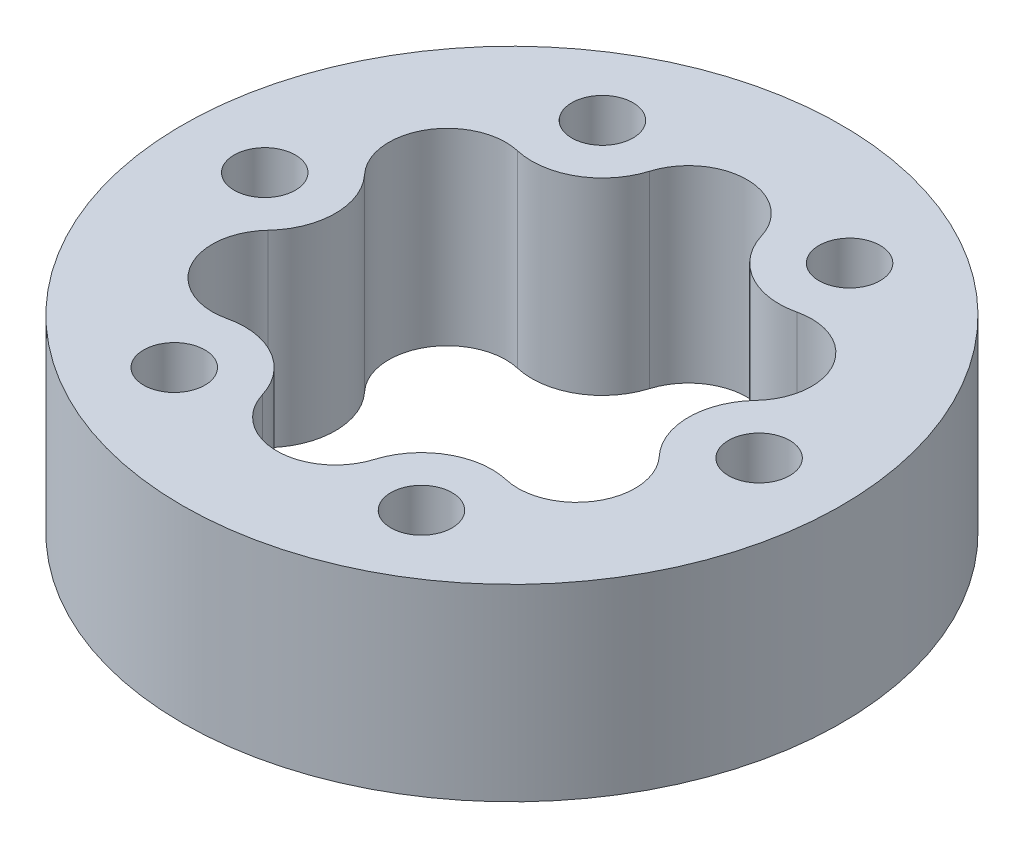
ISO-10303-21;
HEADER;
FILE_DESCRIPTION(('STEP AP214'),'2;1');
FILE_NAME('part.step','',(''),(''),'','','');
FILE_SCHEMA(('AUTOMOTIVE_DESIGN { 1 0 10303 214 1 1 1 1 }'));
ENDSEC;
DATA;
#1=APPLICATION_CONTEXT('core data for automotive mechanical design processes');
#2=APPLICATION_PROTOCOL_DEFINITION('international standard','automotive_design',2000,#1);
#3=PRODUCT_CONTEXT('',#1,'mechanical');
#4=PRODUCT('Part','Part','',(#3));
#5=PRODUCT_RELATED_PRODUCT_CATEGORY('part','',(#4));
#6=PRODUCT_DEFINITION_FORMATION('','',#4);
#7=PRODUCT_DEFINITION_CONTEXT('part definition',#1,'design');
#8=PRODUCT_DEFINITION('design','',#6,#7);
#9=PRODUCT_DEFINITION_SHAPE('','',#8);
#10=(LENGTH_UNIT() NAMED_UNIT(*) SI_UNIT(.MILLI.,.METRE.));
#11=(NAMED_UNIT(*) PLANE_ANGLE_UNIT() SI_UNIT($,.RADIAN.));
#12=(NAMED_UNIT(*) SI_UNIT($,.STERADIAN.) SOLID_ANGLE_UNIT());
#13=UNCERTAINTY_MEASURE_WITH_UNIT(LENGTH_MEASURE(1.E-05),#10,'distance_accuracy_value','');
#14=(GEOMETRIC_REPRESENTATION_CONTEXT(3) GLOBAL_UNCERTAINTY_ASSIGNED_CONTEXT((#13)) GLOBAL_UNIT_ASSIGNED_CONTEXT((#10,
#11,#12)) REPRESENTATION_CONTEXT('',''));
#15=CARTESIAN_POINT('',(0.,0.,0.));
#16=DIRECTION('',(0.,0.,1.));
#17=DIRECTION('',(1.,0.,0.));
#18=AXIS2_PLACEMENT_3D('',#15,#16,#17);
#19=CARTESIAN_POINT('',(0.,16.,0.));
#20=DIRECTION('',(0.,1.,0.));
#21=DIRECTION('',(0.,0.,1.));
#22=AXIS2_PLACEMENT_3D('',#19,#20,#21);
#23=PLANE('',#22);
#24=CARTESIAN_POINT('',(-10.5000000000001,16.,-18.1865334794733));
#25=DIRECTION('',(0.,1.,0.));
#26=DIRECTION('',(0.,0.,1.));
#27=AXIS2_PLACEMENT_3D('',#24,#25,#26);
#28=CIRCLE('',#27,2.6);
#29=CARTESIAN_POINT('',(-10.5000000000001,16.,-15.5865334794733));
#30=VERTEX_POINT('',#29);
#31=EDGE_CURVE('E230',#30,#30,#28,.T.);
#32=ORIENTED_EDGE('',*,*,#31,.F.);
#33=EDGE_LOOP('',(#32));
#34=FACE_BOUND('',#33,.T.);
#35=CARTESIAN_POINT('',(-10.5000000000001,16.,18.1865334794731));
#36=DIRECTION('',(0.,1.,0.));
#37=DIRECTION('',(0.,0.,1.));
#38=AXIS2_PLACEMENT_3D('',#35,#36,#37);
#39=CIRCLE('',#38,2.6);
#40=CARTESIAN_POINT('',(-10.5000000000001,16.,20.7865334794731));
#41=VERTEX_POINT('',#40);
#42=EDGE_CURVE('E242',#41,#41,#39,.T.);
#43=ORIENTED_EDGE('',*,*,#42,.F.);
#44=EDGE_LOOP('',(#43));
#45=FACE_BOUND('',#44,.T.);
#46=CARTESIAN_POINT('',(20.9999999999999,16.,0.));
#47=DIRECTION('',(0.,1.,0.));
#48=DIRECTION('',(0.,0.,1.));
#49=AXIS2_PLACEMENT_3D('',#46,#47,#48);
#50=CIRCLE('',#49,2.6);
#51=CARTESIAN_POINT('',(20.9999999999999,16.,2.59999999999992));
#52=VERTEX_POINT('',#51);
#53=EDGE_CURVE('E254',#52,#52,#50,.T.);
#54=ORIENTED_EDGE('',*,*,#53,.F.);
#55=EDGE_LOOP('',(#54));
#56=FACE_BOUND('',#55,.T.);
#57=CARTESIAN_POINT('',(0.,16.,0.));
#58=DIRECTION('',(0.,1.,0.));
#59=DIRECTION('',(0.,0.,1.));
#60=AXIS2_PLACEMENT_3D('',#57,#58,#59);
#61=CIRCLE('',#60,28.);
#62=CARTESIAN_POINT('',(0.,16.,28.));
#63=VERTEX_POINT('',#62);
#64=EDGE_CURVE('E11',#63,#63,#61,.T.);
#65=ORIENTED_EDGE('',*,*,#64,.T.);
#66=EDGE_LOOP('',(#65));
#67=FACE_BOUND('',#66,.T.);
#68=CARTESIAN_POINT('',(10.4999999999999,16.,-18.1865334794733));
#69=DIRECTION('',(0.,1.,0.));
#70=DIRECTION('',(0.,0.,1.));
#71=AXIS2_PLACEMENT_3D('',#68,#69,#70);
#72=CIRCLE('',#71,2.6);
#73=CARTESIAN_POINT('',(10.4999999999999,16.,-15.5865334794733));
#74=VERTEX_POINT('',#73);
#75=EDGE_CURVE('E260',#74,#74,#72,.T.);
#76=ORIENTED_EDGE('',*,*,#75,.F.);
#77=EDGE_LOOP('',(#76));
#78=FACE_BOUND('',#77,.T.);
#79=CARTESIAN_POINT('',(10.4999999999999,16.,18.1865334794731));
#80=DIRECTION('',(0.,1.,0.));
#81=DIRECTION('',(0.,0.,1.));
#82=AXIS2_PLACEMENT_3D('',#79,#80,#81);
#83=CIRCLE('',#82,2.6);
#84=CARTESIAN_POINT('',(10.4999999999999,16.,20.7865334794731));
#85=VERTEX_POINT('',#84);
#86=EDGE_CURVE('E248',#85,#85,#83,.T.);
#87=ORIENTED_EDGE('',*,*,#86,.F.);
#88=EDGE_LOOP('',(#87));
#89=FACE_BOUND('',#88,.T.);
#90=CARTESIAN_POINT('',(-21.,16.,1.2805208282618E-13));
#91=DIRECTION('',(0.,1.,0.));
#92=DIRECTION('',(0.,0.,1.));
#93=AXIS2_PLACEMENT_3D('',#90,#91,#92);
#94=CIRCLE('',#93,2.6);
#95=CARTESIAN_POINT('',(-21.,16.,2.60000000000013));
#96=VERTEX_POINT('',#95);
#97=EDGE_CURVE('E236',#96,#96,#94,.T.);
#98=ORIENTED_EDGE('',*,*,#97,.F.);
#99=EDGE_LOOP('',(#98));
#100=FACE_BOUND('',#99,.T.);
#101=CARTESIAN_POINT('',(0.,16.,-15.));
#102=DIRECTION('',(0.,1.,0.));
#103=DIRECTION('',(0.,0.,1.));
#104=AXIS2_PLACEMENT_3D('',#101,#102,#103);
#105=CIRCLE('',#104,4.97287544884227);
#106=CARTESIAN_POINT('',(4.75856966173348,16.,-16.444127765859));
#107=VERTEX_POINT('',#106);
#108=CARTESIAN_POINT('',(-4.75856923533456,16.,-16.4441291708941));
#109=VERTEX_POINT('',#108);
#110=EDGE_CURVE('E136',#107,#109,#105,.T.);
#111=ORIENTED_EDGE('',*,*,#110,.F.);
#112=CARTESIAN_POINT('',(10.4999999999999,16.,-18.1865334794733));
#113=DIRECTION('',(0.,1.,0.));
#114=DIRECTION('',(0.,0.,1.));
#115=AXIS2_PLACEMENT_3D('',#112,#113,#114);
#116=CIRCLE('',#115,6.00000000000013);
#117=CARTESIAN_POINT('',(11.8617489874396,16.,-12.343106428914));
#118=VERTEX_POINT('',#117);
#119=EDGE_CURVE('E226',#118,#107,#116,.F.);
#120=ORIENTED_EDGE('',*,*,#119,.F.);
#121=CARTESIAN_POINT('',(12.9903810567666,16.,-7.49999999999997));
#122=DIRECTION('',(0.,1.,0.));
#123=DIRECTION('',(0.,0.,1.));
#124=AXIS2_PLACEMENT_3D('',#121,#122,#123);
#125=CIRCLE('',#124,4.97287544884224);
#126=CARTESIAN_POINT('',(16.6203172191778,16.,-4.10102167019009));
#127=VERTEX_POINT('',#126);
#128=EDGE_CURVE('E224',#127,#118,#125,.T.);
#129=ORIENTED_EDGE('',*,*,#128,.F.);
#130=CARTESIAN_POINT('',(21.,16.,0.));
#131=DIRECTION('',(0.,1.,0.));
#132=DIRECTION('',(0.,0.,1.));
#133=AXIS2_PLACEMENT_3D('',#130,#131,#132);
#134=CIRCLE('',#133,6.00000000000022);
#135=CARTESIAN_POINT('',(16.6203182227742,16.,4.10102274198015));
#136=VERTEX_POINT('',#135);
#137=EDGE_CURVE('E222',#136,#127,#134,.F.);
#138=ORIENTED_EDGE('',*,*,#137,.F.);
#139=CARTESIAN_POINT('',(12.9903810567665,16.,7.50000000000006));
#140=DIRECTION('',(0.,1.,0.));
#141=DIRECTION('',(0.,0.,1.));
#142=AXIS2_PLACEMENT_3D('',#139,#140,#141);
#143=CIRCLE('',#142,4.97287544884221);
#144=CARTESIAN_POINT('',(11.8617475574439,16.,12.3431060956689));
#145=VERTEX_POINT('',#144);
#146=EDGE_CURVE('E220',#145,#136,#143,.T.);
#147=ORIENTED_EDGE('',*,*,#146,.F.);
#148=CARTESIAN_POINT('',(10.5,16.,18.1865334794732));
#149=DIRECTION('',(0.,1.,0.));
#150=DIRECTION('',(0.,0.,1.));
#151=AXIS2_PLACEMENT_3D('',#148,#149,#150);
#152=CIRCLE('',#151,6.00000000000022);
#153=CARTESIAN_POINT('',(4.75856923533452,16.,16.4441291708941));
#154=VERTEX_POINT('',#153);
#155=EDGE_CURVE('E218',#154,#145,#152,.F.);
#156=ORIENTED_EDGE('',*,*,#155,.F.);
#157=CARTESIAN_POINT('',(-1.04517089427603E-13,16.,15.));
#158=DIRECTION('',(0.,1.,0.));
#159=DIRECTION('',(0.,0.,1.));
#160=AXIS2_PLACEMENT_3D('',#157,#158,#159);
#161=CIRCLE('',#160,4.97287544884223);
#162=CARTESIAN_POINT('',(-4.75856966173388,16.,16.4441277658589));
#163=VERTEX_POINT('',#162);
#164=EDGE_CURVE('E216',#163,#154,#161,.T.);
#165=ORIENTED_EDGE('',*,*,#164,.F.);
#166=CARTESIAN_POINT('',(-10.5,16.,18.1865334794732));
#167=DIRECTION('',(0.,1.,0.));
#168=DIRECTION('',(0.,0.,1.));
#169=AXIS2_PLACEMENT_3D('',#166,#167,#168);
#170=CIRCLE('',#169,6.00000000000014);
#171=CARTESIAN_POINT('',(-11.8617489874398,16.,12.3431064289139));
#172=VERTEX_POINT('',#171);
#173=EDGE_CURVE('E214',#172,#163,#170,.F.);
#174=ORIENTED_EDGE('',*,*,#173,.F.);
#175=CARTESIAN_POINT('',(-12.9903810567667,16.,7.49999999999988));
#176=DIRECTION('',(0.,1.,0.));
#177=DIRECTION('',(0.,0.,1.));
#178=AXIS2_PLACEMENT_3D('',#175,#176,#177);
#179=CIRCLE('',#178,4.97287544884227);
#180=CARTESIAN_POINT('',(-16.620317219178,16.,4.10102167019005));
#181=VERTEX_POINT('',#180);
#182=EDGE_CURVE('E212',#181,#172,#179,.T.);
#183=ORIENTED_EDGE('',*,*,#182,.F.);
#184=CARTESIAN_POINT('',(-21.,16.,0.));
#185=DIRECTION('',(0.,1.,0.));
#186=DIRECTION('',(0.,0.,1.));
#187=AXIS2_PLACEMENT_3D('',#184,#185,#186);
#188=CIRCLE('',#187,6.00000000000005);
#189=CARTESIAN_POINT('',(-16.6203182227744,16.,-4.10102274198029));
#190=VERTEX_POINT('',#189);
#191=EDGE_CURVE('E210',#190,#181,#188,.F.);
#192=ORIENTED_EDGE('',*,*,#191,.F.);
#193=CARTESIAN_POINT('',(-12.9903810567665,16.,-7.50000000000015));
#194=DIRECTION('',(0.,1.,0.));
#195=DIRECTION('',(0.,0.,1.));
#196=AXIS2_PLACEMENT_3D('',#193,#194,#195);
#197=CIRCLE('',#196,4.97287544884229);
#198=CARTESIAN_POINT('',(-11.8617475574441,16.,-12.3431060956691));
#199=VERTEX_POINT('',#198);
#200=EDGE_CURVE('E208',#199,#190,#197,.T.);
#201=ORIENTED_EDGE('',*,*,#200,.F.);
#202=CARTESIAN_POINT('',(-10.4999999999999,16.,-18.1865334794733));
#203=DIRECTION('',(0.,1.,0.));
#204=DIRECTION('',(0.,0.,1.));
#205=AXIS2_PLACEMENT_3D('',#202,#203,#204);
#206=CIRCLE('',#205,6.00000000000006);
#207=EDGE_CURVE('E178',#109,#199,#206,.F.);
#208=ORIENTED_EDGE('',*,*,#207,.F.);
#209=EDGE_LOOP('',(#111,#120,#129,#138,#147,#156,#165,#174,#183,#192,#201,#208));
#210=FACE_BOUND('',#209,.T.);
#211=ADVANCED_FACE('F41',(#34,#45,#56,#67,#78,#89,#100,#210),#23,.T.);
#212=CARTESIAN_POINT('',(0.,0.,0.));
#213=DIRECTION('',(0.,1.,0.));
#214=DIRECTION('',(0.,0.,1.));
#215=AXIS2_PLACEMENT_3D('',#212,#213,#214);
#216=PLANE('',#215);
#217=CARTESIAN_POINT('',(0.,0.,0.));
#218=DIRECTION('',(0.,1.,0.));
#219=DIRECTION('',(0.,0.,1.));
#220=AXIS2_PLACEMENT_3D('',#217,#218,#219);
#221=CIRCLE('',#220,28.);
#222=CARTESIAN_POINT('',(0.,0.,28.));
#223=VERTEX_POINT('',#222);
#224=EDGE_CURVE('E45',#223,#223,#221,.T.);
#225=ORIENTED_EDGE('',*,*,#224,.F.);
#226=EDGE_LOOP('',(#225));
#227=FACE_BOUND('',#226,.T.);
#228=CARTESIAN_POINT('',(10.4999999999999,0.,-18.1865334794733));
#229=DIRECTION('',(0.,1.,0.));
#230=DIRECTION('',(0.,0.,1.));
#231=AXIS2_PLACEMENT_3D('',#228,#229,#230);
#232=CIRCLE('',#231,2.6);
#233=CARTESIAN_POINT('',(10.4999999999999,0.,-15.5865334794733));
#234=VERTEX_POINT('',#233);
#235=EDGE_CURVE('E257',#234,#234,#232,.T.);
#236=ORIENTED_EDGE('',*,*,#235,.T.);
#237=EDGE_LOOP('',(#236));
#238=FACE_BOUND('',#237,.T.);
#239=CARTESIAN_POINT('',(20.9999999999999,0.,0.));
#240=DIRECTION('',(0.,1.,0.));
#241=DIRECTION('',(0.,0.,1.));
#242=AXIS2_PLACEMENT_3D('',#239,#240,#241);
#243=CIRCLE('',#242,2.6);
#244=CARTESIAN_POINT('',(20.9999999999999,0.,2.59999999999992));
#245=VERTEX_POINT('',#244);
#246=EDGE_CURVE('E251',#245,#245,#243,.T.);
#247=ORIENTED_EDGE('',*,*,#246,.T.);
#248=EDGE_LOOP('',(#247));
#249=FACE_BOUND('',#248,.T.);
#250=CARTESIAN_POINT('',(10.4999999999999,0.,18.1865334794731));
#251=DIRECTION('',(0.,1.,0.));
#252=DIRECTION('',(0.,0.,1.));
#253=AXIS2_PLACEMENT_3D('',#250,#251,#252);
#254=CIRCLE('',#253,2.6);
#255=CARTESIAN_POINT('',(10.4999999999999,0.,20.7865334794731));
#256=VERTEX_POINT('',#255);
#257=EDGE_CURVE('E245',#256,#256,#254,.T.);
#258=ORIENTED_EDGE('',*,*,#257,.T.);
#259=EDGE_LOOP('',(#258));
#260=FACE_BOUND('',#259,.T.);
#261=CARTESIAN_POINT('',(-10.5000000000001,0.,18.1865334794731));
#262=DIRECTION('',(0.,1.,0.));
#263=DIRECTION('',(0.,0.,1.));
#264=AXIS2_PLACEMENT_3D('',#261,#262,#263);
#265=CIRCLE('',#264,2.6);
#266=CARTESIAN_POINT('',(-10.5000000000001,0.,20.7865334794731));
#267=VERTEX_POINT('',#266);
#268=EDGE_CURVE('E239',#267,#267,#265,.T.);
#269=ORIENTED_EDGE('',*,*,#268,.T.);
#270=EDGE_LOOP('',(#269));
#271=FACE_BOUND('',#270,.T.);
#272=CARTESIAN_POINT('',(-21.,0.,1.2805208282618E-13));
#273=DIRECTION('',(0.,1.,0.));
#274=DIRECTION('',(0.,0.,1.));
#275=AXIS2_PLACEMENT_3D('',#272,#273,#274);
#276=CIRCLE('',#275,2.6);
#277=CARTESIAN_POINT('',(-21.,0.,2.60000000000013));
#278=VERTEX_POINT('',#277);
#279=EDGE_CURVE('E233',#278,#278,#276,.T.);
#280=ORIENTED_EDGE('',*,*,#279,.T.);
#281=EDGE_LOOP('',(#280));
#282=FACE_BOUND('',#281,.T.);
#283=CARTESIAN_POINT('',(-10.5000000000001,0.,-18.1865334794733));
#284=DIRECTION('',(0.,1.,0.));
#285=DIRECTION('',(0.,0.,1.));
#286=AXIS2_PLACEMENT_3D('',#283,#284,#285);
#287=CIRCLE('',#286,2.6);
#288=CARTESIAN_POINT('',(-10.5000000000001,0.,-15.5865334794733));
#289=VERTEX_POINT('',#288);
#290=EDGE_CURVE('E229',#289,#289,#287,.T.);
#291=ORIENTED_EDGE('',*,*,#290,.T.);
#292=EDGE_LOOP('',(#291));
#293=FACE_BOUND('',#292,.T.);
#294=CARTESIAN_POINT('',(10.4999999999999,0.,-18.1865334794733));
#295=DIRECTION('',(0.,-1.,0.));
#296=DIRECTION('',(0.,0.,1.));
#297=AXIS2_PLACEMENT_3D('',#294,#295,#296);
#298=CIRCLE('',#297,6.00000000000013);
#299=CARTESIAN_POINT('',(11.8617489874396,0.,-12.343106428914));
#300=VERTEX_POINT('',#299);
#301=CARTESIAN_POINT('',(4.75856966173348,0.,-16.444127765859));
#302=VERTEX_POINT('',#301);
#303=EDGE_CURVE('E139',#300,#302,#298,.T.);
#304=ORIENTED_EDGE('',*,*,#303,.T.);
#305=CARTESIAN_POINT('',(0.,0.,-15.));
#306=DIRECTION('',(0.,1.,0.));
#307=DIRECTION('',(0.,0.,-1.));
#308=AXIS2_PLACEMENT_3D('',#305,#306,#307);
#309=CIRCLE('',#308,4.97287544884227);
#310=CARTESIAN_POINT('',(-4.75856923533456,0.,-16.4441291708941));
#311=VERTEX_POINT('',#310);
#312=EDGE_CURVE('E133',#302,#311,#309,.T.);
#313=ORIENTED_EDGE('',*,*,#312,.T.);
#314=CARTESIAN_POINT('',(-10.4999999999999,0.,-18.1865334794733));
#315=DIRECTION('',(0.,-1.,0.));
#316=DIRECTION('',(0.,0.,1.));
#317=AXIS2_PLACEMENT_3D('',#314,#315,#316);
#318=CIRCLE('',#317,6.00000000000006);
#319=CARTESIAN_POINT('',(-11.8617475574442,0.,-12.3431060956689));
#320=VERTEX_POINT('',#319);
#321=EDGE_CURVE('E142',#311,#320,#318,.T.);
#322=ORIENTED_EDGE('',*,*,#321,.T.);
#323=CARTESIAN_POINT('',(-12.9903810567665,0.,-7.50000000000015));
#324=DIRECTION('',(0.,1.,0.));
#325=DIRECTION('',(0.,0.,-1.));
#326=AXIS2_PLACEMENT_3D('',#323,#324,#325);
#327=CIRCLE('',#326,4.97287544884229);
#328=CARTESIAN_POINT('',(-16.6203182227744,0.,-4.10102274198029));
#329=VERTEX_POINT('',#328);
#330=EDGE_CURVE('E64',#320,#329,#327,.T.);
#331=ORIENTED_EDGE('',*,*,#330,.T.);
#332=CARTESIAN_POINT('',(-21.,0.,0.));
#333=DIRECTION('',(0.,-1.,0.));
#334=DIRECTION('',(0.,0.,1.));
#335=AXIS2_PLACEMENT_3D('',#332,#333,#334);
#336=CIRCLE('',#335,6.00000000000005);
#337=CARTESIAN_POINT('',(-16.620317219178,0.,4.10102167019005));
#338=VERTEX_POINT('',#337);
#339=EDGE_CURVE('E152',#329,#338,#336,.T.);
#340=ORIENTED_EDGE('',*,*,#339,.T.);
#341=CARTESIAN_POINT('',(-12.9903810567667,0.,7.49999999999988));
#342=DIRECTION('',(0.,1.,0.));
#343=DIRECTION('',(0.,0.,-1.));
#344=AXIS2_PLACEMENT_3D('',#341,#342,#343);
#345=CIRCLE('',#344,4.97287544884227);
#346=CARTESIAN_POINT('',(-11.8617489874398,0.,12.3431064289139));
#347=VERTEX_POINT('',#346);
#348=EDGE_CURVE('E155',#338,#347,#345,.T.);
#349=ORIENTED_EDGE('',*,*,#348,.T.);
#350=CARTESIAN_POINT('',(-10.5,0.,18.1865334794732));
#351=DIRECTION('',(0.,-1.,0.));
#352=DIRECTION('',(0.,0.,1.));
#353=AXIS2_PLACEMENT_3D('',#350,#351,#352);
#354=CIRCLE('',#353,6.00000000000014);
#355=CARTESIAN_POINT('',(-4.75856966173388,0.,16.4441277658589));
#356=VERTEX_POINT('',#355);
#357=EDGE_CURVE('E158',#347,#356,#354,.T.);
#358=ORIENTED_EDGE('',*,*,#357,.T.);
#359=CARTESIAN_POINT('',(-1.04517089427603E-13,0.,15.));
#360=DIRECTION('',(0.,1.,0.));
#361=DIRECTION('',(0.,0.,-1.));
#362=AXIS2_PLACEMENT_3D('',#359,#360,#361);
#363=CIRCLE('',#362,4.97287544884223);
#364=CARTESIAN_POINT('',(4.75856923533452,0.,16.4441291708941));
#365=VERTEX_POINT('',#364);
#366=EDGE_CURVE('E161',#356,#365,#363,.T.);
#367=ORIENTED_EDGE('',*,*,#366,.T.);
#368=CARTESIAN_POINT('',(10.5,0.,18.1865334794732));
#369=DIRECTION('',(0.,-1.,0.));
#370=DIRECTION('',(0.,0.,1.));
#371=AXIS2_PLACEMENT_3D('',#368,#369,#370);
#372=CIRCLE('',#371,6.00000000000022);
#373=CARTESIAN_POINT('',(11.8617475574439,0.,12.3431060956689));
#374=VERTEX_POINT('',#373);
#375=EDGE_CURVE('E164',#365,#374,#372,.T.);
#376=ORIENTED_EDGE('',*,*,#375,.T.);
#377=CARTESIAN_POINT('',(12.9903810567665,0.,7.50000000000006));
#378=DIRECTION('',(0.,1.,0.));
#379=DIRECTION('',(0.,0.,-1.));
#380=AXIS2_PLACEMENT_3D('',#377,#378,#379);
#381=CIRCLE('',#380,4.97287544884221);
#382=CARTESIAN_POINT('',(16.6203182227742,0.,4.10102274198015));
#383=VERTEX_POINT('',#382);
#384=EDGE_CURVE('E167',#374,#383,#381,.T.);
#385=ORIENTED_EDGE('',*,*,#384,.T.);
#386=CARTESIAN_POINT('',(21.,0.,0.));
#387=DIRECTION('',(0.,-1.,0.));
#388=DIRECTION('',(0.,0.,1.));
#389=AXIS2_PLACEMENT_3D('',#386,#387,#388);
#390=CIRCLE('',#389,6.00000000000022);
#391=CARTESIAN_POINT('',(16.6203172191778,0.,-4.10102167019009));
#392=VERTEX_POINT('',#391);
#393=EDGE_CURVE('E170',#383,#392,#390,.T.);
#394=ORIENTED_EDGE('',*,*,#393,.T.);
#395=CARTESIAN_POINT('',(12.9903810567666,0.,-7.49999999999997));
#396=DIRECTION('',(0.,1.,0.));
#397=DIRECTION('',(0.,0.,-1.));
#398=AXIS2_PLACEMENT_3D('',#395,#396,#397);
#399=CIRCLE('',#398,4.97287544884224);
#400=EDGE_CURVE('E173',#392,#300,#399,.T.);
#401=ORIENTED_EDGE('',*,*,#400,.T.);
#402=EDGE_LOOP('',(#304,#313,#322,#331,#340,#349,#358,#367,#376,#385,#394,#401));
#403=FACE_BOUND('',#402,.T.);
#404=ADVANCED_FACE('F146',(#227,#238,#249,#260,#271,#282,#293,#403),#216,.F.);
#405=CARTESIAN_POINT('',(0.,16.,0.));
#406=DIRECTION('',(0.,-1.,0.));
#407=DIRECTION('',(0.,0.,-1.));
#408=AXIS2_PLACEMENT_3D('',#405,#406,#407);
#409=CYLINDRICAL_SURFACE('',#408,28.);
#410=ORIENTED_EDGE('',*,*,#64,.F.);
#411=EDGE_LOOP('',(#410));
#412=FACE_BOUND('',#411,.T.);
#413=ORIENTED_EDGE('',*,*,#224,.T.);
#414=EDGE_LOOP('',(#413));
#415=FACE_BOUND('',#414,.T.);
#416=ADVANCED_FACE('F43',(#412,#415),#409,.T.);
#417=CARTESIAN_POINT('',(10.4999999999999,16.,-18.1865334794733));
#418=DIRECTION('',(0.,-1.,0.));
#419=DIRECTION('',(0.,0.,-1.));
#420=AXIS2_PLACEMENT_3D('',#417,#418,#419);
#421=CYLINDRICAL_SURFACE('',#420,2.6);
#422=ORIENTED_EDGE('',*,*,#75,.T.);
#423=EDGE_LOOP('',(#422));
#424=FACE_BOUND('',#423,.T.);
#425=ORIENTED_EDGE('',*,*,#235,.F.);
#426=EDGE_LOOP('',(#425));
#427=FACE_BOUND('',#426,.T.);
#428=ADVANCED_FACE('F268',(#424,#427),#421,.F.);
#429=CARTESIAN_POINT('',(20.9999999999999,16.,0.));
#430=DIRECTION('',(0.,-1.,0.));
#431=DIRECTION('',(0.,0.,-1.));
#432=AXIS2_PLACEMENT_3D('',#429,#430,#431);
#433=CYLINDRICAL_SURFACE('',#432,2.6);
#434=ORIENTED_EDGE('',*,*,#53,.T.);
#435=EDGE_LOOP('',(#434));
#436=FACE_BOUND('',#435,.T.);
#437=ORIENTED_EDGE('',*,*,#246,.F.);
#438=EDGE_LOOP('',(#437));
#439=FACE_BOUND('',#438,.T.);
#440=ADVANCED_FACE('F270',(#436,#439),#433,.F.);
#441=CARTESIAN_POINT('',(10.4999999999999,16.,18.1865334794731));
#442=DIRECTION('',(0.,-1.,0.));
#443=DIRECTION('',(0.,0.,-1.));
#444=AXIS2_PLACEMENT_3D('',#441,#442,#443);
#445=CYLINDRICAL_SURFACE('',#444,2.6);
#446=ORIENTED_EDGE('',*,*,#86,.T.);
#447=EDGE_LOOP('',(#446));
#448=FACE_BOUND('',#447,.T.);
#449=ORIENTED_EDGE('',*,*,#257,.F.);
#450=EDGE_LOOP('',(#449));
#451=FACE_BOUND('',#450,.T.);
#452=ADVANCED_FACE('F277',(#448,#451),#445,.F.);
#453=CARTESIAN_POINT('',(-10.5000000000001,16.,18.1865334794731));
#454=DIRECTION('',(0.,-1.,0.));
#455=DIRECTION('',(0.,0.,-1.));
#456=AXIS2_PLACEMENT_3D('',#453,#454,#455);
#457=CYLINDRICAL_SURFACE('',#456,2.6);
#458=ORIENTED_EDGE('',*,*,#42,.T.);
#459=EDGE_LOOP('',(#458));
#460=FACE_BOUND('',#459,.T.);
#461=ORIENTED_EDGE('',*,*,#268,.F.);
#462=EDGE_LOOP('',(#461));
#463=FACE_BOUND('',#462,.T.);
#464=ADVANCED_FACE('F374',(#460,#463),#457,.F.);
#465=CARTESIAN_POINT('',(-21.,16.,1.2805208282618E-13));
#466=DIRECTION('',(0.,-1.,0.));
#467=DIRECTION('',(0.,0.,-1.));
#468=AXIS2_PLACEMENT_3D('',#465,#466,#467);
#469=CYLINDRICAL_SURFACE('',#468,2.6);
#470=ORIENTED_EDGE('',*,*,#97,.T.);
#471=EDGE_LOOP('',(#470));
#472=FACE_BOUND('',#471,.T.);
#473=ORIENTED_EDGE('',*,*,#279,.F.);
#474=EDGE_LOOP('',(#473));
#475=FACE_BOUND('',#474,.T.);
#476=ADVANCED_FACE('F370',(#472,#475),#469,.F.);
#477=CARTESIAN_POINT('',(-10.5000000000001,16.,-18.1865334794733));
#478=DIRECTION('',(0.,-1.,0.));
#479=DIRECTION('',(0.,0.,-1.));
#480=AXIS2_PLACEMENT_3D('',#477,#478,#479);
#481=CYLINDRICAL_SURFACE('',#480,2.6);
#482=ORIENTED_EDGE('',*,*,#31,.T.);
#483=EDGE_LOOP('',(#482));
#484=FACE_BOUND('',#483,.T.);
#485=ORIENTED_EDGE('',*,*,#290,.F.);
#486=EDGE_LOOP('',(#485));
#487=FACE_BOUND('',#486,.T.);
#488=ADVANCED_FACE('F348',(#484,#487),#481,.F.);
#489=CARTESIAN_POINT('',(0.,0.,-15.));
#490=DIRECTION('',(0.,1.,0.));
#491=DIRECTION('',(0.,0.,1.));
#492=AXIS2_PLACEMENT_3D('',#489,#490,#491);
#493=CYLINDRICAL_SURFACE('',#492,4.97287544884227);
#494=ORIENTED_EDGE('',*,*,#110,.T.);
#495=DIRECTION('',(0.,1.,0.));
#496=VECTOR('',#495,1.);
#497=CARTESIAN_POINT('',(-4.75856923533456,0.,-16.4441291708941));
#498=LINE('',#497,#496);
#499=EDGE_CURVE('E56',#311,#109,#498,.T.);
#500=ORIENTED_EDGE('',*,*,#499,.F.);
#501=ORIENTED_EDGE('',*,*,#312,.F.);
#502=DIRECTION('',(0.,1.,0.));
#503=VECTOR('',#502,1.);
#504=CARTESIAN_POINT('',(4.75856966173348,0.,-16.444127765859));
#505=LINE('',#504,#503);
#506=EDGE_CURVE('E176',#302,#107,#505,.T.);
#507=ORIENTED_EDGE('',*,*,#506,.T.);
#508=EDGE_LOOP('',(#494,#500,#501,#507));
#509=FACE_BOUND('',#508,.T.);
#510=ADVANCED_FACE('F130',(#509),#493,.F.);
#511=CARTESIAN_POINT('',(10.4999999999999,0.,-18.1865334794733));
#512=DIRECTION('',(0.,1.,0.));
#513=DIRECTION('',(0.,0.,1.));
#514=AXIS2_PLACEMENT_3D('',#511,#512,#513);
#515=CYLINDRICAL_SURFACE('',#514,6.00000000000013);
#516=ORIENTED_EDGE('',*,*,#119,.T.);
#517=ORIENTED_EDGE('',*,*,#506,.F.);
#518=ORIENTED_EDGE('',*,*,#303,.F.);
#519=DIRECTION('',(0.,1.,0.));
#520=VECTOR('',#519,1.);
#521=CARTESIAN_POINT('',(11.8617489874396,0.,-12.343106428914));
#522=LINE('',#521,#520);
#523=EDGE_CURVE('E179',#300,#118,#522,.T.);
#524=ORIENTED_EDGE('',*,*,#523,.T.);
#525=EDGE_LOOP('',(#516,#517,#518,#524));
#526=FACE_BOUND('',#525,.T.);
#527=ADVANCED_FACE('F340',(#526),#515,.T.);
#528=CARTESIAN_POINT('',(12.9903810567666,0.,-7.49999999999997));
#529=DIRECTION('',(0.,1.,0.));
#530=DIRECTION('',(0.,0.,1.));
#531=AXIS2_PLACEMENT_3D('',#528,#529,#530);
#532=CYLINDRICAL_SURFACE('',#531,4.97287544884224);
#533=ORIENTED_EDGE('',*,*,#128,.T.);
#534=ORIENTED_EDGE('',*,*,#523,.F.);
#535=ORIENTED_EDGE('',*,*,#400,.F.);
#536=DIRECTION('',(0.,1.,0.));
#537=VECTOR('',#536,1.);
#538=CARTESIAN_POINT('',(16.6203172191778,0.,-4.10102167019009));
#539=LINE('',#538,#537);
#540=EDGE_CURVE('E182',#392,#127,#539,.T.);
#541=ORIENTED_EDGE('',*,*,#540,.T.);
#542=EDGE_LOOP('',(#533,#534,#535,#541));
#543=FACE_BOUND('',#542,.T.);
#544=ADVANCED_FACE('F338',(#543),#532,.F.);
#545=CARTESIAN_POINT('',(21.,0.,0.));
#546=DIRECTION('',(0.,1.,0.));
#547=DIRECTION('',(0.,0.,1.));
#548=AXIS2_PLACEMENT_3D('',#545,#546,#547);
#549=CYLINDRICAL_SURFACE('',#548,6.00000000000022);
#550=ORIENTED_EDGE('',*,*,#137,.T.);
#551=ORIENTED_EDGE('',*,*,#540,.F.);
#552=ORIENTED_EDGE('',*,*,#393,.F.);
#553=DIRECTION('',(0.,1.,0.));
#554=VECTOR('',#553,1.);
#555=CARTESIAN_POINT('',(16.6203182227742,0.,4.10102274198015));
#556=LINE('',#555,#554);
#557=EDGE_CURVE('E185',#383,#136,#556,.T.);
#558=ORIENTED_EDGE('',*,*,#557,.T.);
#559=EDGE_LOOP('',(#550,#551,#552,#558));
#560=FACE_BOUND('',#559,.T.);
#561=ADVANCED_FACE('F335',(#560),#549,.T.);
#562=CARTESIAN_POINT('',(12.9903810567665,0.,7.50000000000006));
#563=DIRECTION('',(0.,1.,0.));
#564=DIRECTION('',(0.,0.,1.));
#565=AXIS2_PLACEMENT_3D('',#562,#563,#564);
#566=CYLINDRICAL_SURFACE('',#565,4.97287544884221);
#567=ORIENTED_EDGE('',*,*,#146,.T.);
#568=ORIENTED_EDGE('',*,*,#557,.F.);
#569=ORIENTED_EDGE('',*,*,#384,.F.);
#570=DIRECTION('',(0.,1.,0.));
#571=VECTOR('',#570,1.);
#572=CARTESIAN_POINT('',(11.8617475574439,0.,12.3431060956689));
#573=LINE('',#572,#571);
#574=EDGE_CURVE('E188',#374,#145,#573,.T.);
#575=ORIENTED_EDGE('',*,*,#574,.T.);
#576=EDGE_LOOP('',(#567,#568,#569,#575));
#577=FACE_BOUND('',#576,.T.);
#578=ADVANCED_FACE('F331',(#577),#566,.F.);
#579=CARTESIAN_POINT('',(10.5,0.,18.1865334794732));
#580=DIRECTION('',(0.,1.,0.));
#581=DIRECTION('',(0.,0.,1.));
#582=AXIS2_PLACEMENT_3D('',#579,#580,#581);
#583=CYLINDRICAL_SURFACE('',#582,6.00000000000022);
#584=ORIENTED_EDGE('',*,*,#155,.T.);
#585=ORIENTED_EDGE('',*,*,#574,.F.);
#586=ORIENTED_EDGE('',*,*,#375,.F.);
#587=DIRECTION('',(0.,1.,0.));
#588=VECTOR('',#587,1.);
#589=CARTESIAN_POINT('',(4.75856923533452,0.,16.4441291708941));
#590=LINE('',#589,#588);
#591=EDGE_CURVE('E191',#365,#154,#590,.T.);
#592=ORIENTED_EDGE('',*,*,#591,.T.);
#593=EDGE_LOOP('',(#584,#585,#586,#592));
#594=FACE_BOUND('',#593,.T.);
#595=ADVANCED_FACE('F327',(#594),#583,.T.);
#596=CARTESIAN_POINT('',(-1.04517089427603E-13,0.,15.));
#597=DIRECTION('',(0.,1.,0.));
#598=DIRECTION('',(0.,0.,1.));
#599=AXIS2_PLACEMENT_3D('',#596,#597,#598);
#600=CYLINDRICAL_SURFACE('',#599,4.97287544884223);
#601=ORIENTED_EDGE('',*,*,#164,.T.);
#602=ORIENTED_EDGE('',*,*,#591,.F.);
#603=ORIENTED_EDGE('',*,*,#366,.F.);
#604=DIRECTION('',(0.,1.,0.));
#605=VECTOR('',#604,1.);
#606=CARTESIAN_POINT('',(-4.75856966173388,0.,16.4441277658589));
#607=LINE('',#606,#605);
#608=EDGE_CURVE('E194',#356,#163,#607,.T.);
#609=ORIENTED_EDGE('',*,*,#608,.T.);
#610=EDGE_LOOP('',(#601,#602,#603,#609));
#611=FACE_BOUND('',#610,.T.);
#612=ADVANCED_FACE('F324',(#611),#600,.F.);
#613=CARTESIAN_POINT('',(-10.5,0.,18.1865334794732));
#614=DIRECTION('',(0.,1.,0.));
#615=DIRECTION('',(0.,0.,1.));
#616=AXIS2_PLACEMENT_3D('',#613,#614,#615);
#617=CYLINDRICAL_SURFACE('',#616,6.00000000000014);
#618=ORIENTED_EDGE('',*,*,#173,.T.);
#619=ORIENTED_EDGE('',*,*,#608,.F.);
#620=ORIENTED_EDGE('',*,*,#357,.F.);
#621=DIRECTION('',(0.,1.,0.));
#622=VECTOR('',#621,1.);
#623=CARTESIAN_POINT('',(-11.8617489874398,0.,12.3431064289139));
#624=LINE('',#623,#622);
#625=EDGE_CURVE('E197',#347,#172,#624,.T.);
#626=ORIENTED_EDGE('',*,*,#625,.T.);
#627=EDGE_LOOP('',(#618,#619,#620,#626));
#628=FACE_BOUND('',#627,.T.);
#629=ADVANCED_FACE('F320',(#628),#617,.T.);
#630=CARTESIAN_POINT('',(-12.9903810567667,0.,7.49999999999988));
#631=DIRECTION('',(0.,1.,0.));
#632=DIRECTION('',(0.,0.,1.));
#633=AXIS2_PLACEMENT_3D('',#630,#631,#632);
#634=CYLINDRICAL_SURFACE('',#633,4.97287544884227);
#635=ORIENTED_EDGE('',*,*,#182,.T.);
#636=ORIENTED_EDGE('',*,*,#625,.F.);
#637=ORIENTED_EDGE('',*,*,#348,.F.);
#638=DIRECTION('',(0.,1.,0.));
#639=VECTOR('',#638,1.);
#640=CARTESIAN_POINT('',(-16.620317219178,0.,4.10102167019005));
#641=LINE('',#640,#639);
#642=EDGE_CURVE('E200',#338,#181,#641,.T.);
#643=ORIENTED_EDGE('',*,*,#642,.T.);
#644=EDGE_LOOP('',(#635,#636,#637,#643));
#645=FACE_BOUND('',#644,.T.);
#646=ADVANCED_FACE('F316',(#645),#634,.F.);
#647=CARTESIAN_POINT('',(-21.,0.,0.));
#648=DIRECTION('',(0.,1.,0.));
#649=DIRECTION('',(0.,0.,1.));
#650=AXIS2_PLACEMENT_3D('',#647,#648,#649);
#651=CYLINDRICAL_SURFACE('',#650,6.00000000000005);
#652=ORIENTED_EDGE('',*,*,#191,.T.);
#653=ORIENTED_EDGE('',*,*,#642,.F.);
#654=ORIENTED_EDGE('',*,*,#339,.F.);
#655=DIRECTION('',(0.,1.,0.));
#656=VECTOR('',#655,1.);
#657=CARTESIAN_POINT('',(-16.6203182227744,0.,-4.10102274198029));
#658=LINE('',#657,#656);
#659=EDGE_CURVE('E203',#329,#190,#658,.T.);
#660=ORIENTED_EDGE('',*,*,#659,.T.);
#661=EDGE_LOOP('',(#652,#653,#654,#660));
#662=FACE_BOUND('',#661,.T.);
#663=ADVANCED_FACE('F311',(#662),#651,.T.);
#664=CARTESIAN_POINT('',(-12.9903810567665,0.,-7.50000000000015));
#665=DIRECTION('',(0.,1.,0.));
#666=DIRECTION('',(0.,0.,1.));
#667=AXIS2_PLACEMENT_3D('',#664,#665,#666);
#668=CYLINDRICAL_SURFACE('',#667,4.97287544884229);
#669=ORIENTED_EDGE('',*,*,#200,.T.);
#670=ORIENTED_EDGE('',*,*,#659,.F.);
#671=ORIENTED_EDGE('',*,*,#330,.F.);
#672=DIRECTION('',(0.,1.,0.));
#673=VECTOR('',#672,1.);
#674=CARTESIAN_POINT('',(-11.8617475574441,0.,-12.3431060956691));
#675=LINE('',#674,#673);
#676=EDGE_CURVE('E138',#320,#199,#675,.T.);
#677=ORIENTED_EDGE('',*,*,#676,.T.);
#678=EDGE_LOOP('',(#669,#670,#671,#677));
#679=FACE_BOUND('',#678,.T.);
#680=ADVANCED_FACE('F308',(#679),#668,.F.);
#681=CARTESIAN_POINT('',(-10.4999999999999,0.,-18.1865334794733));
#682=DIRECTION('',(0.,1.,0.));
#683=DIRECTION('',(0.,0.,1.));
#684=AXIS2_PLACEMENT_3D('',#681,#682,#683);
#685=CYLINDRICAL_SURFACE('',#684,6.00000000000006);
#686=ORIENTED_EDGE('',*,*,#207,.T.);
#687=ORIENTED_EDGE('',*,*,#676,.F.);
#688=ORIENTED_EDGE('',*,*,#321,.F.);
#689=ORIENTED_EDGE('',*,*,#499,.T.);
#690=EDGE_LOOP('',(#686,#687,#688,#689));
#691=FACE_BOUND('',#690,.T.);
#692=ADVANCED_FACE('F143',(#691),#685,.T.);
#693=CLOSED_SHELL('',(#211,#404,#416,#428,#440,#452,#464,#476,#488,#510,#527,#544,#561,#578,
#595,#612,#629,#646,#663,#680,#692));
#694=MANIFOLD_SOLID_BREP('B2',#693);
#695=ADVANCED_BREP_SHAPE_REPRESENTATION('',(#18,#694),#14);
#696=SHAPE_DEFINITION_REPRESENTATION(#9,#695);
ENDSEC;
END-ISO-10303-21;
